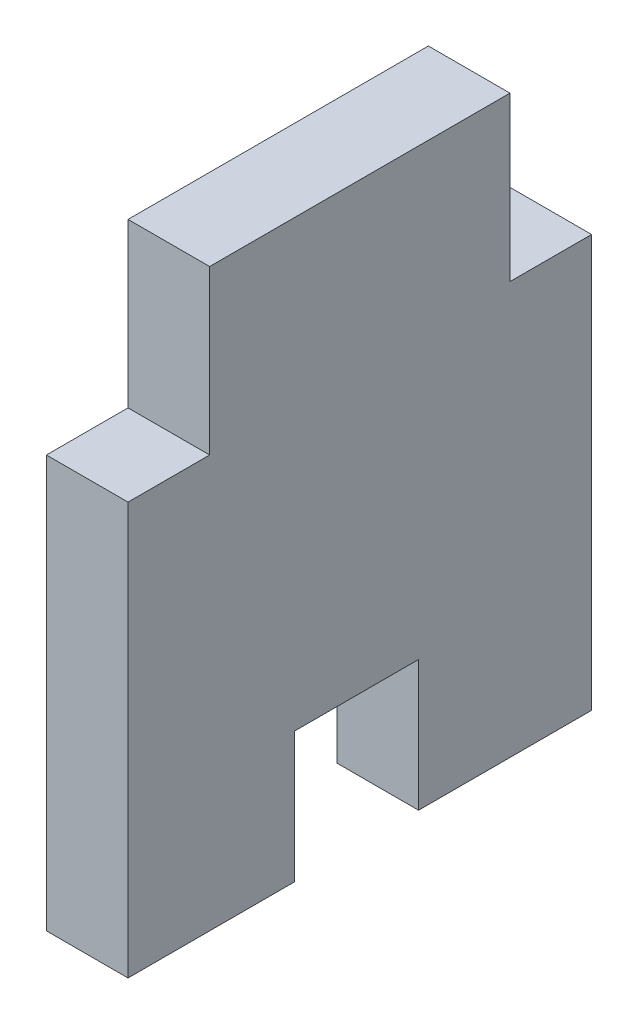
ISO-10303-21;
HEADER;
FILE_DESCRIPTION(('STEP AP214'),'2;1');
FILE_NAME('part.step','',(''),(''),'','','');
FILE_SCHEMA(('AUTOMOTIVE_DESIGN { 1 0 10303 214 1 1 1 1 }'));
ENDSEC;
DATA;
#1=APPLICATION_CONTEXT('core data for automotive mechanical design processes');
#2=APPLICATION_PROTOCOL_DEFINITION('international standard','automotive_design',2000,#1);
#3=PRODUCT_CONTEXT('',#1,'mechanical');
#4=PRODUCT('Part','Part','',(#3));
#5=PRODUCT_RELATED_PRODUCT_CATEGORY('part','',(#4));
#6=PRODUCT_DEFINITION_FORMATION('','',#4);
#7=PRODUCT_DEFINITION_CONTEXT('part definition',#1,'design');
#8=PRODUCT_DEFINITION('design','',#6,#7);
#9=PRODUCT_DEFINITION_SHAPE('','',#8);
#10=(LENGTH_UNIT() NAMED_UNIT(*) SI_UNIT(.MILLI.,.METRE.));
#11=(NAMED_UNIT(*) PLANE_ANGLE_UNIT() SI_UNIT($,.RADIAN.));
#12=(NAMED_UNIT(*) SI_UNIT($,.STERADIAN.) SOLID_ANGLE_UNIT());
#13=UNCERTAINTY_MEASURE_WITH_UNIT(LENGTH_MEASURE(1.E-05),#10,'distance_accuracy_value','');
#14=(GEOMETRIC_REPRESENTATION_CONTEXT(3) GLOBAL_UNCERTAINTY_ASSIGNED_CONTEXT((#13)) GLOBAL_UNIT_ASSIGNED_CONTEXT((#10,
#11,#12)) REPRESENTATION_CONTEXT('',''));
#15=CARTESIAN_POINT('',(0.,0.,0.));
#16=DIRECTION('',(0.,0.,1.));
#17=DIRECTION('',(1.,0.,0.));
#18=AXIS2_PLACEMENT_3D('',#15,#16,#17);
#19=CARTESIAN_POINT('',(6.35,12.7,11.684));
#20=DIRECTION('',(0.,0.,-1.));
#21=DIRECTION('',(0.,1.,0.));
#22=AXIS2_PLACEMENT_3D('',#19,#20,#21);
#23=PLANE('',#22);
#24=DIRECTION('',(0.,-1.,0.));
#25=VECTOR('',#24,1.);
#26=CARTESIAN_POINT('',(0.,12.7,11.684));
#27=LINE('',#26,#25);
#28=CARTESIAN_POINT('',(0.,12.7,11.684));
#29=VERTEX_POINT('',#28);
#30=CARTESIAN_POINT('',(0.,0.,11.684));
#31=VERTEX_POINT('',#30);
#32=EDGE_CURVE('E159',#29,#31,#27,.T.);
#33=ORIENTED_EDGE('',*,*,#32,.T.);
#34=DIRECTION('',(-1.,0.,0.));
#35=VECTOR('',#34,1.);
#36=CARTESIAN_POINT('',(6.35,0.,11.684));
#37=LINE('',#36,#35);
#38=CARTESIAN_POINT('',(6.35,0.,11.684));
#39=VERTEX_POINT('',#38);
#40=EDGE_CURVE('E11',#39,#31,#37,.T.);
#41=ORIENTED_EDGE('',*,*,#40,.F.);
#42=DIRECTION('',(0.,-1.,0.));
#43=VECTOR('',#42,1.);
#44=CARTESIAN_POINT('',(6.35,12.7,11.684));
#45=LINE('',#44,#43);
#46=CARTESIAN_POINT('',(6.35,12.7,11.684));
#47=VERTEX_POINT('',#46);
#48=EDGE_CURVE('E181',#47,#39,#45,.T.);
#49=ORIENTED_EDGE('',*,*,#48,.F.);
#50=DIRECTION('',(-1.,0.,0.));
#51=VECTOR('',#50,1.);
#52=CARTESIAN_POINT('',(6.35,12.7,11.684));
#53=LINE('',#52,#51);
#54=EDGE_CURVE('E155',#47,#29,#53,.T.);
#55=ORIENTED_EDGE('',*,*,#54,.T.);
#56=EDGE_LOOP('',(#33,#41,#49,#55));
#57=FACE_BOUND('',#56,.T.);
#58=ADVANCED_FACE('F39',(#57),#23,.F.);
#59=CARTESIAN_POINT('',(6.35,0.,11.684));
#60=DIRECTION('',(0.,-1.,0.));
#61=DIRECTION('',(0.,0.,-1.));
#62=AXIS2_PLACEMENT_3D('',#59,#60,#61);
#63=PLANE('',#62);
#64=DIRECTION('',(0.,0.,1.));
#65=VECTOR('',#64,1.);
#66=CARTESIAN_POINT('',(0.,0.,11.684));
#67=LINE('',#66,#65);
#68=CARTESIAN_POINT('',(0.,0.,18.034));
#69=VERTEX_POINT('',#68);
#70=EDGE_CURVE('E162',#31,#69,#67,.T.);
#71=ORIENTED_EDGE('',*,*,#70,.T.);
#72=DIRECTION('',(-1.,0.,0.));
#73=VECTOR('',#72,1.);
#74=CARTESIAN_POINT('',(6.35,0.,18.034));
#75=LINE('',#74,#73);
#76=CARTESIAN_POINT('',(6.35,0.,18.034));
#77=VERTEX_POINT('',#76);
#78=EDGE_CURVE('E47',#77,#69,#75,.T.);
#79=ORIENTED_EDGE('',*,*,#78,.F.);
#80=DIRECTION('',(0.,0.,1.));
#81=VECTOR('',#80,1.);
#82=CARTESIAN_POINT('',(6.35,0.,11.684));
#83=LINE('',#82,#81);
#84=EDGE_CURVE('E110',#39,#77,#83,.T.);
#85=ORIENTED_EDGE('',*,*,#84,.F.);
#86=ORIENTED_EDGE('',*,*,#40,.T.);
#87=EDGE_LOOP('',(#71,#79,#85,#86));
#88=FACE_BOUND('',#87,.T.);
#89=ADVANCED_FACE('F259',(#88),#63,.F.);
#90=CARTESIAN_POINT('',(6.35,0.,18.034));
#91=DIRECTION('',(0.,0.,-1.));
#92=DIRECTION('',(-1.,0.,0.));
#93=AXIS2_PLACEMENT_3D('',#90,#91,#92);
#94=PLANE('',#93);
#95=DIRECTION('',(0.,-1.,0.));
#96=VECTOR('',#95,1.);
#97=CARTESIAN_POINT('',(0.,0.,18.034));
#98=LINE('',#97,#96);
#99=CARTESIAN_POINT('',(0.,-32.0675,18.034));
#100=VERTEX_POINT('',#99);
#101=EDGE_CURVE('E164',#69,#100,#98,.T.);
#102=ORIENTED_EDGE('',*,*,#101,.T.);
#103=DIRECTION('',(-1.,0.,0.));
#104=VECTOR('',#103,1.);
#105=CARTESIAN_POINT('',(6.35,-32.0675,18.034));
#106=LINE('',#105,#104);
#107=CARTESIAN_POINT('',(6.35,-32.0675,18.034));
#108=VERTEX_POINT('',#107);
#109=EDGE_CURVE('E200',#108,#100,#106,.T.);
#110=ORIENTED_EDGE('',*,*,#109,.F.);
#111=DIRECTION('',(0.,-1.,0.));
#112=VECTOR('',#111,1.);
#113=CARTESIAN_POINT('',(6.35,0.,18.034));
#114=LINE('',#113,#112);
#115=EDGE_CURVE('E208',#77,#108,#114,.T.);
#116=ORIENTED_EDGE('',*,*,#115,.F.);
#117=ORIENTED_EDGE('',*,*,#78,.T.);
#118=EDGE_LOOP('',(#102,#110,#116,#117));
#119=FACE_BOUND('',#118,.T.);
#120=ADVANCED_FACE('F206',(#119),#94,.F.);
#121=CARTESIAN_POINT('',(6.35,-32.0675,18.034));
#122=DIRECTION('',(0.,1.,0.));
#123=DIRECTION('',(0.,0.,1.));
#124=AXIS2_PLACEMENT_3D('',#121,#122,#123);
#125=PLANE('',#124);
#126=DIRECTION('',(0.,0.,-1.));
#127=VECTOR('',#126,1.);
#128=CARTESIAN_POINT('',(0.,-32.0675,18.034));
#129=LINE('',#128,#127);
#130=CARTESIAN_POINT('',(0.,-32.0675,5.08));
#131=VERTEX_POINT('',#130);
#132=EDGE_CURVE('E166',#100,#131,#129,.T.);
#133=ORIENTED_EDGE('',*,*,#132,.T.);
#134=DIRECTION('',(-1.,0.,0.));
#135=VECTOR('',#134,1.);
#136=CARTESIAN_POINT('',(6.35,-32.0675,5.08));
#137=LINE('',#136,#135);
#138=CARTESIAN_POINT('',(6.35,-32.0675,5.08));
#139=VERTEX_POINT('',#138);
#140=EDGE_CURVE('E197',#139,#131,#137,.T.);
#141=ORIENTED_EDGE('',*,*,#140,.F.);
#142=DIRECTION('',(0.,0.,-1.));
#143=VECTOR('',#142,1.);
#144=CARTESIAN_POINT('',(6.35,-32.0675,18.034));
#145=LINE('',#144,#143);
#146=EDGE_CURVE('E226',#108,#139,#145,.T.);
#147=ORIENTED_EDGE('',*,*,#146,.F.);
#148=ORIENTED_EDGE('',*,*,#109,.T.);
#149=EDGE_LOOP('',(#133,#141,#147,#148));
#150=FACE_BOUND('',#149,.T.);
#151=ADVANCED_FACE('F217',(#150),#125,.F.);
#152=CARTESIAN_POINT('',(6.35,-32.0675,5.08));
#153=DIRECTION('',(0.,0.,1.));
#154=DIRECTION('',(0.,-1.,0.));
#155=AXIS2_PLACEMENT_3D('',#152,#153,#154);
#156=PLANE('',#155);
#157=DIRECTION('',(0.,1.,0.));
#158=VECTOR('',#157,1.);
#159=CARTESIAN_POINT('',(0.,-32.0675,5.08));
#160=LINE('',#159,#158);
#161=CARTESIAN_POINT('',(0.,-21.9075,5.08));
#162=VERTEX_POINT('',#161);
#163=EDGE_CURVE('E168',#131,#162,#160,.T.);
#164=ORIENTED_EDGE('',*,*,#163,.T.);
#165=DIRECTION('',(-1.,0.,0.));
#166=VECTOR('',#165,1.);
#167=CARTESIAN_POINT('',(6.35,-21.9075,5.08));
#168=LINE('',#167,#166);
#169=CARTESIAN_POINT('',(6.35,-21.9075,5.08));
#170=VERTEX_POINT('',#169);
#171=EDGE_CURVE('E194',#170,#162,#168,.T.);
#172=ORIENTED_EDGE('',*,*,#171,.F.);
#173=DIRECTION('',(0.,1.,0.));
#174=VECTOR('',#173,1.);
#175=CARTESIAN_POINT('',(6.35,-32.0675,5.08));
#176=LINE('',#175,#174);
#177=EDGE_CURVE('E223',#139,#170,#176,.T.);
#178=ORIENTED_EDGE('',*,*,#177,.F.);
#179=ORIENTED_EDGE('',*,*,#140,.T.);
#180=EDGE_LOOP('',(#164,#172,#178,#179));
#181=FACE_BOUND('',#180,.T.);
#182=ADVANCED_FACE('F221',(#181),#156,.F.);
#183=CARTESIAN_POINT('',(6.35,-21.9075,5.08));
#184=DIRECTION('',(0.,1.,0.));
#185=DIRECTION('',(0.,0.,1.));
#186=AXIS2_PLACEMENT_3D('',#183,#184,#185);
#187=PLANE('',#186);
#188=DIRECTION('',(0.,0.,-1.));
#189=VECTOR('',#188,1.);
#190=CARTESIAN_POINT('',(0.,-21.9075,5.08));
#191=LINE('',#190,#189);
#192=CARTESIAN_POINT('',(0.,-21.9075,-4.572));
#193=VERTEX_POINT('',#192);
#194=EDGE_CURVE('E170',#162,#193,#191,.T.);
#195=ORIENTED_EDGE('',*,*,#194,.T.);
#196=DIRECTION('',(-1.,0.,0.));
#197=VECTOR('',#196,1.);
#198=CARTESIAN_POINT('',(6.35,-21.9075,-4.572));
#199=LINE('',#198,#197);
#200=CARTESIAN_POINT('',(6.35,-21.9075,-4.572));
#201=VERTEX_POINT('',#200);
#202=EDGE_CURVE('E191',#201,#193,#199,.T.);
#203=ORIENTED_EDGE('',*,*,#202,.F.);
#204=DIRECTION('',(0.,0.,-1.));
#205=VECTOR('',#204,1.);
#206=CARTESIAN_POINT('',(6.35,-21.9075,5.08));
#207=LINE('',#206,#205);
#208=EDGE_CURVE('E225',#170,#201,#207,.T.);
#209=ORIENTED_EDGE('',*,*,#208,.F.);
#210=ORIENTED_EDGE('',*,*,#171,.T.);
#211=EDGE_LOOP('',(#195,#203,#209,#210));
#212=FACE_BOUND('',#211,.T.);
#213=ADVANCED_FACE('F272',(#212),#187,.F.);
#214=CARTESIAN_POINT('',(6.35,-21.9075,-4.572));
#215=DIRECTION('',(0.,0.,-1.));
#216=DIRECTION('',(0.,1.,0.));
#217=AXIS2_PLACEMENT_3D('',#214,#215,#216);
#218=PLANE('',#217);
#219=DIRECTION('',(0.,-1.,0.));
#220=VECTOR('',#219,1.);
#221=CARTESIAN_POINT('',(0.,-21.9075,-4.572));
#222=LINE('',#221,#220);
#223=CARTESIAN_POINT('',(0.,-32.0675,-4.572));
#224=VERTEX_POINT('',#223);
#225=EDGE_CURVE('E172',#193,#224,#222,.T.);
#226=ORIENTED_EDGE('',*,*,#225,.T.);
#227=DIRECTION('',(-1.,0.,0.));
#228=VECTOR('',#227,1.);
#229=CARTESIAN_POINT('',(6.35,-32.0675,-4.572));
#230=LINE('',#229,#228);
#231=CARTESIAN_POINT('',(6.35,-32.0675,-4.572));
#232=VERTEX_POINT('',#231);
#233=EDGE_CURVE('E188',#232,#224,#230,.T.);
#234=ORIENTED_EDGE('',*,*,#233,.F.);
#235=DIRECTION('',(0.,-1.,0.));
#236=VECTOR('',#235,1.);
#237=CARTESIAN_POINT('',(6.35,-21.9075,-4.572));
#238=LINE('',#237,#236);
#239=EDGE_CURVE('E228',#201,#232,#238,.T.);
#240=ORIENTED_EDGE('',*,*,#239,.F.);
#241=ORIENTED_EDGE('',*,*,#202,.T.);
#242=EDGE_LOOP('',(#226,#234,#240,#241));
#243=FACE_BOUND('',#242,.T.);
#244=ADVANCED_FACE('F275',(#243),#218,.F.);
#245=CARTESIAN_POINT('',(6.35,-32.0675,-4.572));
#246=DIRECTION('',(0.,1.,0.));
#247=DIRECTION('',(0.,0.,1.));
#248=AXIS2_PLACEMENT_3D('',#245,#246,#247);
#249=PLANE('',#248);
#250=DIRECTION('',(0.,0.,-1.));
#251=VECTOR('',#250,1.);
#252=CARTESIAN_POINT('',(0.,-32.0675,-4.572));
#253=LINE('',#252,#251);
#254=CARTESIAN_POINT('',(0.,-32.0675,-18.034));
#255=VERTEX_POINT('',#254);
#256=EDGE_CURVE('E174',#224,#255,#253,.T.);
#257=ORIENTED_EDGE('',*,*,#256,.T.);
#258=DIRECTION('',(-1.,0.,0.));
#259=VECTOR('',#258,1.);
#260=CARTESIAN_POINT('',(6.35,-32.0675,-18.034));
#261=LINE('',#260,#259);
#262=CARTESIAN_POINT('',(6.35,-32.0675,-18.034));
#263=VERTEX_POINT('',#262);
#264=EDGE_CURVE('E185',#263,#255,#261,.T.);
#265=ORIENTED_EDGE('',*,*,#264,.F.);
#266=DIRECTION('',(0.,0.,-1.));
#267=VECTOR('',#266,1.);
#268=CARTESIAN_POINT('',(6.35,-32.0675,-4.572));
#269=LINE('',#268,#267);
#270=EDGE_CURVE('E234',#232,#263,#269,.T.);
#271=ORIENTED_EDGE('',*,*,#270,.F.);
#272=ORIENTED_EDGE('',*,*,#233,.T.);
#273=EDGE_LOOP('',(#257,#265,#271,#272));
#274=FACE_BOUND('',#273,.T.);
#275=ADVANCED_FACE('F240',(#274),#249,.F.);
#276=CARTESIAN_POINT('',(6.35,0.,-18.034));
#277=DIRECTION('',(0.,0.,1.));
#278=DIRECTION('',(1.,0.,0.));
#279=AXIS2_PLACEMENT_3D('',#276,#277,#278);
#280=PLANE('',#279);
#281=DIRECTION('',(0.,1.,0.));
#282=VECTOR('',#281,1.);
#283=CARTESIAN_POINT('',(0.,0.,-18.034));
#284=LINE('',#283,#282);
#285=CARTESIAN_POINT('',(0.,0.,-18.034));
#286=VERTEX_POINT('',#285);
#287=EDGE_CURVE('E176',#255,#286,#284,.T.);
#288=ORIENTED_EDGE('',*,*,#287,.T.);
#289=DIRECTION('',(-1.,0.,0.));
#290=VECTOR('',#289,1.);
#291=CARTESIAN_POINT('',(6.35,0.,-18.034));
#292=LINE('',#291,#290);
#293=CARTESIAN_POINT('',(6.35,0.,-18.034));
#294=VERTEX_POINT('',#293);
#295=EDGE_CURVE('E150',#294,#286,#292,.T.);
#296=ORIENTED_EDGE('',*,*,#295,.F.);
#297=DIRECTION('',(0.,1.,0.));
#298=VECTOR('',#297,1.);
#299=CARTESIAN_POINT('',(6.35,0.,-18.034));
#300=LINE('',#299,#298);
#301=EDGE_CURVE('E141',#263,#294,#300,.T.);
#302=ORIENTED_EDGE('',*,*,#301,.F.);
#303=ORIENTED_EDGE('',*,*,#264,.T.);
#304=EDGE_LOOP('',(#288,#296,#302,#303));
#305=FACE_BOUND('',#304,.T.);
#306=ADVANCED_FACE('F244',(#305),#280,.F.);
#307=CARTESIAN_POINT('',(6.35,0.,-11.684));
#308=DIRECTION('',(0.,-1.,0.));
#309=DIRECTION('',(0.,0.,-1.));
#310=AXIS2_PLACEMENT_3D('',#307,#308,#309);
#311=PLANE('',#310);
#312=DIRECTION('',(0.,0.,1.));
#313=VECTOR('',#312,1.);
#314=CARTESIAN_POINT('',(0.,0.,-11.684));
#315=LINE('',#314,#313);
#316=CARTESIAN_POINT('',(0.,0.,-11.684));
#317=VERTEX_POINT('',#316);
#318=EDGE_CURVE('E149',#286,#317,#315,.T.);
#319=ORIENTED_EDGE('',*,*,#318,.T.);
#320=DIRECTION('',(-1.,0.,0.));
#321=VECTOR('',#320,1.);
#322=CARTESIAN_POINT('',(6.35,0.,-11.684));
#323=LINE('',#322,#321);
#324=CARTESIAN_POINT('',(6.35,0.,-11.684));
#325=VERTEX_POINT('',#324);
#326=EDGE_CURVE('E146',#325,#317,#323,.T.);
#327=ORIENTED_EDGE('',*,*,#326,.F.);
#328=DIRECTION('',(0.,0.,1.));
#329=VECTOR('',#328,1.);
#330=CARTESIAN_POINT('',(6.35,0.,-11.684));
#331=LINE('',#330,#329);
#332=EDGE_CURVE('E135',#294,#325,#331,.T.);
#333=ORIENTED_EDGE('',*,*,#332,.F.);
#334=ORIENTED_EDGE('',*,*,#295,.T.);
#335=EDGE_LOOP('',(#319,#327,#333,#334));
#336=FACE_BOUND('',#335,.T.);
#337=ADVANCED_FACE('F147',(#336),#311,.F.);
#338=CARTESIAN_POINT('',(6.35,12.7,-11.684));
#339=DIRECTION('',(0.,0.,1.));
#340=DIRECTION('',(0.,-1.,0.));
#341=AXIS2_PLACEMENT_3D('',#338,#339,#340);
#342=PLANE('',#341);
#343=DIRECTION('',(0.,1.,0.));
#344=VECTOR('',#343,1.);
#345=CARTESIAN_POINT('',(0.,12.7,-11.684));
#346=LINE('',#345,#344);
#347=CARTESIAN_POINT('',(0.,12.7,-11.684));
#348=VERTEX_POINT('',#347);
#349=EDGE_CURVE('E96',#317,#348,#346,.T.);
#350=ORIENTED_EDGE('',*,*,#349,.T.);
#351=DIRECTION('',(-1.,0.,0.));
#352=VECTOR('',#351,1.);
#353=CARTESIAN_POINT('',(6.35,12.7,-11.684));
#354=LINE('',#353,#352);
#355=CARTESIAN_POINT('',(6.35,12.7,-11.684));
#356=VERTEX_POINT('',#355);
#357=EDGE_CURVE('E151',#356,#348,#354,.T.);
#358=ORIENTED_EDGE('',*,*,#357,.F.);
#359=DIRECTION('',(0.,1.,0.));
#360=VECTOR('',#359,1.);
#361=CARTESIAN_POINT('',(6.35,12.7,-11.684));
#362=LINE('',#361,#360);
#363=EDGE_CURVE('E139',#325,#356,#362,.T.);
#364=ORIENTED_EDGE('',*,*,#363,.F.);
#365=ORIENTED_EDGE('',*,*,#326,.T.);
#366=EDGE_LOOP('',(#350,#358,#364,#365));
#367=FACE_BOUND('',#366,.T.);
#368=ADVANCED_FACE('F153',(#367),#342,.F.);
#369=CARTESIAN_POINT('',(6.35,12.7,-11.684));
#370=DIRECTION('',(0.,-1.,0.));
#371=DIRECTION('',(0.,0.,-1.));
#372=AXIS2_PLACEMENT_3D('',#369,#370,#371);
#373=PLANE('',#372);
#374=DIRECTION('',(0.,0.,1.));
#375=VECTOR('',#374,1.);
#376=CARTESIAN_POINT('',(0.,12.7,-11.684));
#377=LINE('',#376,#375);
#378=EDGE_CURVE('E102',#348,#29,#377,.T.);
#379=ORIENTED_EDGE('',*,*,#378,.T.);
#380=ORIENTED_EDGE('',*,*,#54,.F.);
#381=DIRECTION('',(0.,0.,1.));
#382=VECTOR('',#381,1.);
#383=CARTESIAN_POINT('',(6.35,12.7,-11.684));
#384=LINE('',#383,#382);
#385=EDGE_CURVE('E55',#356,#47,#384,.T.);
#386=ORIENTED_EDGE('',*,*,#385,.F.);
#387=ORIENTED_EDGE('',*,*,#357,.T.);
#388=EDGE_LOOP('',(#379,#380,#386,#387));
#389=FACE_BOUND('',#388,.T.);
#390=ADVANCED_FACE('F248',(#389),#373,.F.);
#391=CARTESIAN_POINT('',(6.35,0.,0.));
#392=DIRECTION('',(-1.,0.,0.));
#393=DIRECTION('',(0.,0.,1.));
#394=AXIS2_PLACEMENT_3D('',#391,#392,#393);
#395=PLANE('',#394);
#396=ORIENTED_EDGE('',*,*,#48,.T.);
#397=ORIENTED_EDGE('',*,*,#84,.T.);
#398=ORIENTED_EDGE('',*,*,#115,.T.);
#399=ORIENTED_EDGE('',*,*,#146,.T.);
#400=ORIENTED_EDGE('',*,*,#177,.T.);
#401=ORIENTED_EDGE('',*,*,#208,.T.);
#402=ORIENTED_EDGE('',*,*,#239,.T.);
#403=ORIENTED_EDGE('',*,*,#270,.T.);
#404=ORIENTED_EDGE('',*,*,#301,.T.);
#405=ORIENTED_EDGE('',*,*,#332,.T.);
#406=ORIENTED_EDGE('',*,*,#363,.T.);
#407=ORIENTED_EDGE('',*,*,#385,.T.);
#408=EDGE_LOOP('',(#396,#397,#398,#399,#400,#401,#402,#403,#404,#405,#406,#407));
#409=FACE_BOUND('',#408,.T.);
#410=ADVANCED_FACE('F137',(#409),#395,.F.);
#411=CARTESIAN_POINT('',(0.,0.,0.));
#412=DIRECTION('',(-1.,0.,0.));
#413=DIRECTION('',(0.,0.,1.));
#414=AXIS2_PLACEMENT_3D('',#411,#412,#413);
#415=PLANE('',#414);
#416=ORIENTED_EDGE('',*,*,#32,.F.);
#417=ORIENTED_EDGE('',*,*,#378,.F.);
#418=ORIENTED_EDGE('',*,*,#349,.F.);
#419=ORIENTED_EDGE('',*,*,#318,.F.);
#420=ORIENTED_EDGE('',*,*,#287,.F.);
#421=ORIENTED_EDGE('',*,*,#256,.F.);
#422=ORIENTED_EDGE('',*,*,#225,.F.);
#423=ORIENTED_EDGE('',*,*,#194,.F.);
#424=ORIENTED_EDGE('',*,*,#163,.F.);
#425=ORIENTED_EDGE('',*,*,#132,.F.);
#426=ORIENTED_EDGE('',*,*,#101,.F.);
#427=ORIENTED_EDGE('',*,*,#70,.F.);
#428=EDGE_LOOP('',(#416,#417,#418,#419,#420,#421,#422,#423,#424,#425,#426,#427));
#429=FACE_BOUND('',#428,.T.);
#430=ADVANCED_FACE('F212',(#429),#415,.T.);
#431=CLOSED_SHELL('',(#58,#89,#120,#151,#182,#213,#244,#275,#306,#337,#368,#390,#410,#430));
#432=MANIFOLD_SOLID_BREP('B2',#431);
#433=ADVANCED_BREP_SHAPE_REPRESENTATION('',(#18,#432),#14);
#434=SHAPE_DEFINITION_REPRESENTATION(#9,#433);
ENDSEC;
END-ISO-10303-21;
